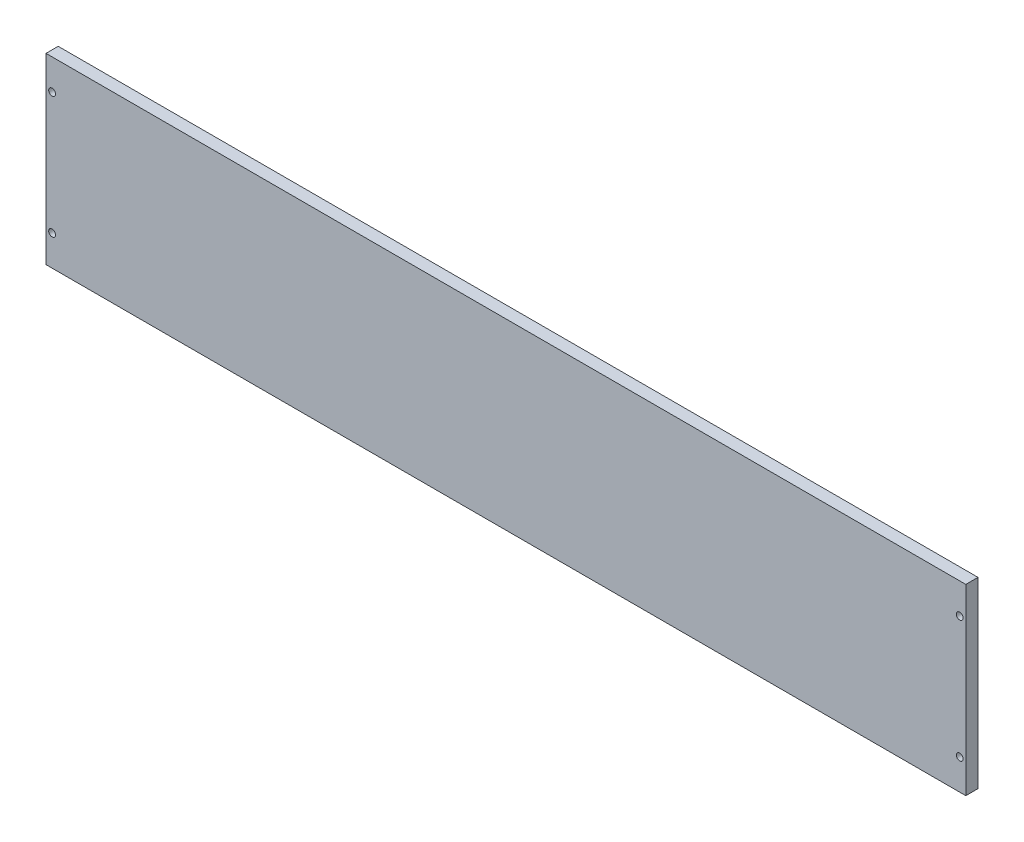
ISO-10303-21;
HEADER;
FILE_DESCRIPTION(('STEP AP214'),'2;1');
FILE_NAME('part.step','',(''),(''),'','','');
FILE_SCHEMA(('AUTOMOTIVE_DESIGN { 1 0 10303 214 1 1 1 1 }'));
ENDSEC;
DATA;
#1=APPLICATION_CONTEXT('core data for automotive mechanical design processes');
#2=APPLICATION_PROTOCOL_DEFINITION('international standard','automotive_design',2000,#1);
#3=PRODUCT_CONTEXT('',#1,'mechanical');
#4=PRODUCT('Part','Part','',(#3));
#5=PRODUCT_RELATED_PRODUCT_CATEGORY('part','',(#4));
#6=PRODUCT_DEFINITION_FORMATION('','',#4);
#7=PRODUCT_DEFINITION_CONTEXT('part definition',#1,'design');
#8=PRODUCT_DEFINITION('design','',#6,#7);
#9=PRODUCT_DEFINITION_SHAPE('','',#8);
#10=(LENGTH_UNIT() NAMED_UNIT(*) SI_UNIT(.MILLI.,.METRE.));
#11=(NAMED_UNIT(*) PLANE_ANGLE_UNIT() SI_UNIT($,.RADIAN.));
#12=(NAMED_UNIT(*) SI_UNIT($,.STERADIAN.) SOLID_ANGLE_UNIT());
#13=UNCERTAINTY_MEASURE_WITH_UNIT(LENGTH_MEASURE(1.E-05),#10,'distance_accuracy_value','');
#14=(GEOMETRIC_REPRESENTATION_CONTEXT(3) GLOBAL_UNCERTAINTY_ASSIGNED_CONTEXT((#13)) GLOBAL_UNIT_ASSIGNED_CONTEXT((#10,
#11,#12)) REPRESENTATION_CONTEXT('',''));
#15=CARTESIAN_POINT('',(0.,0.,0.));
#16=DIRECTION('',(0.,0.,1.));
#17=DIRECTION('',(1.,0.,0.));
#18=AXIS2_PLACEMENT_3D('',#15,#16,#17);
#19=CARTESIAN_POINT('',(0.,0.,5.08));
#20=DIRECTION('',(1.,0.,0.));
#21=DIRECTION('',(0.,0.,-1.));
#22=AXIS2_PLACEMENT_3D('',#19,#20,#21);
#23=PLANE('',#22);
#24=DIRECTION('',(0.,-1.,0.));
#25=VECTOR('',#24,1.);
#26=CARTESIAN_POINT('',(0.,0.,0.));
#27=LINE('',#26,#25);
#28=CARTESIAN_POINT('',(0.,76.2,0.));
#29=VERTEX_POINT('',#28);
#30=CARTESIAN_POINT('',(0.,0.,0.));
#31=VERTEX_POINT('',#30);
#32=EDGE_CURVE('E105',#29,#31,#27,.T.);
#33=ORIENTED_EDGE('',*,*,#32,.T.);
#34=DIRECTION('',(0.,0.,-1.));
#35=VECTOR('',#34,1.);
#36=CARTESIAN_POINT('',(0.,0.,5.08));
#37=LINE('',#36,#35);
#38=CARTESIAN_POINT('',(0.,0.,5.08));
#39=VERTEX_POINT('',#38);
#40=EDGE_CURVE('E11',#39,#31,#37,.T.);
#41=ORIENTED_EDGE('',*,*,#40,.F.);
#42=DIRECTION('',(0.,-1.,0.));
#43=VECTOR('',#42,1.);
#44=CARTESIAN_POINT('',(0.,0.,5.08));
#45=LINE('',#44,#43);
#46=CARTESIAN_POINT('',(0.,76.2,5.08));
#47=VERTEX_POINT('',#46);
#48=EDGE_CURVE('E93',#47,#39,#45,.T.);
#49=ORIENTED_EDGE('',*,*,#48,.F.);
#50=DIRECTION('',(0.,0.,-1.));
#51=VECTOR('',#50,1.);
#52=CARTESIAN_POINT('',(0.,76.2,5.08));
#53=LINE('',#52,#51);
#54=EDGE_CURVE('E101',#47,#29,#53,.T.);
#55=ORIENTED_EDGE('',*,*,#54,.T.);
#56=EDGE_LOOP('',(#33,#41,#49,#55));
#57=FACE_BOUND('',#56,.T.);
#58=ADVANCED_FACE('F42',(#57),#23,.F.);
#59=CARTESIAN_POINT('',(0.,0.,5.08));
#60=DIRECTION('',(0.,1.,0.));
#61=DIRECTION('',(0.,0.,1.));
#62=AXIS2_PLACEMENT_3D('',#59,#60,#61);
#63=PLANE('',#62);
#64=DIRECTION('',(1.,0.,0.));
#65=VECTOR('',#64,1.);
#66=CARTESIAN_POINT('',(0.,0.,0.));
#67=LINE('',#66,#65);
#68=CARTESIAN_POINT('',(383.0066,0.,0.));
#69=VERTEX_POINT('',#68);
#70=EDGE_CURVE('E97',#31,#69,#67,.T.);
#71=ORIENTED_EDGE('',*,*,#70,.T.);
#72=DIRECTION('',(0.,0.,-1.));
#73=VECTOR('',#72,1.);
#74=CARTESIAN_POINT('',(383.0066,0.,5.08));
#75=LINE('',#74,#73);
#76=CARTESIAN_POINT('',(383.0066,0.,5.08));
#77=VERTEX_POINT('',#76);
#78=EDGE_CURVE('E50',#77,#69,#75,.T.);
#79=ORIENTED_EDGE('',*,*,#78,.F.);
#80=DIRECTION('',(1.,0.,0.));
#81=VECTOR('',#80,1.);
#82=CARTESIAN_POINT('',(0.,0.,5.08));
#83=LINE('',#82,#81);
#84=EDGE_CURVE('E88',#39,#77,#83,.T.);
#85=ORIENTED_EDGE('',*,*,#84,.F.);
#86=ORIENTED_EDGE('',*,*,#40,.T.);
#87=EDGE_LOOP('',(#71,#79,#85,#86));
#88=FACE_BOUND('',#87,.T.);
#89=ADVANCED_FACE('F96',(#88),#63,.F.);
#90=CARTESIAN_POINT('',(383.0066,0.,5.08));
#91=DIRECTION('',(-1.,0.,0.));
#92=DIRECTION('',(0.,0.,1.));
#93=AXIS2_PLACEMENT_3D('',#90,#91,#92);
#94=PLANE('',#93);
#95=DIRECTION('',(0.,1.,0.));
#96=VECTOR('',#95,1.);
#97=CARTESIAN_POINT('',(383.0066,0.,0.));
#98=LINE('',#97,#96);
#99=CARTESIAN_POINT('',(383.0066,76.2,0.));
#100=VERTEX_POINT('',#99);
#101=EDGE_CURVE('E75',#69,#100,#98,.T.);
#102=ORIENTED_EDGE('',*,*,#101,.T.);
#103=DIRECTION('',(0.,0.,-1.));
#104=VECTOR('',#103,1.);
#105=CARTESIAN_POINT('',(383.0066,76.2,5.08));
#106=LINE('',#105,#104);
#107=CARTESIAN_POINT('',(383.0066,76.2,5.08));
#108=VERTEX_POINT('',#107);
#109=EDGE_CURVE('E98',#108,#100,#106,.T.);
#110=ORIENTED_EDGE('',*,*,#109,.F.);
#111=DIRECTION('',(0.,1.,0.));
#112=VECTOR('',#111,1.);
#113=CARTESIAN_POINT('',(383.0066,0.,5.08));
#114=LINE('',#113,#112);
#115=EDGE_CURVE('E91',#77,#108,#114,.T.);
#116=ORIENTED_EDGE('',*,*,#115,.F.);
#117=ORIENTED_EDGE('',*,*,#78,.T.);
#118=EDGE_LOOP('',(#102,#110,#116,#117));
#119=FACE_BOUND('',#118,.T.);
#120=ADVANCED_FACE('F99',(#119),#94,.F.);
#121=CARTESIAN_POINT('',(0.,76.2,5.08));
#122=DIRECTION('',(0.,-1.,0.));
#123=DIRECTION('',(0.,0.,-1.));
#124=AXIS2_PLACEMENT_3D('',#121,#122,#123);
#125=PLANE('',#124);
#126=DIRECTION('',(-1.,0.,0.));
#127=VECTOR('',#126,1.);
#128=CARTESIAN_POINT('',(0.,76.2,0.));
#129=LINE('',#128,#127);
#130=EDGE_CURVE('E81',#100,#29,#129,.T.);
#131=ORIENTED_EDGE('',*,*,#130,.T.);
#132=ORIENTED_EDGE('',*,*,#54,.F.);
#133=DIRECTION('',(-1.,0.,0.));
#134=VECTOR('',#133,1.);
#135=CARTESIAN_POINT('',(0.,76.2,5.08));
#136=LINE('',#135,#134);
#137=EDGE_CURVE('E58',#108,#47,#136,.T.);
#138=ORIENTED_EDGE('',*,*,#137,.F.);
#139=ORIENTED_EDGE('',*,*,#109,.T.);
#140=EDGE_LOOP('',(#131,#132,#138,#139));
#141=FACE_BOUND('',#140,.T.);
#142=ADVANCED_FACE('F113',(#141),#125,.F.);
#143=CARTESIAN_POINT('',(0.,0.,5.08));
#144=DIRECTION('',(0.,0.,-1.));
#145=DIRECTION('',(-1.,0.,0.));
#146=AXIS2_PLACEMENT_3D('',#143,#144,#145);
#147=PLANE('',#146);
#148=CARTESIAN_POINT('',(2.54000000000001,12.7,5.08));
#149=DIRECTION('',(0.,0.,1.));
#150=DIRECTION('',(1.,0.,0.));
#151=AXIS2_PLACEMENT_3D('',#148,#149,#150);
#152=CIRCLE('',#151,1.4224);
#153=CARTESIAN_POINT('',(3.96240000000001,12.7,5.08));
#154=VERTEX_POINT('',#153);
#155=EDGE_CURVE('E122',#154,#154,#152,.T.);
#156=ORIENTED_EDGE('',*,*,#155,.F.);
#157=EDGE_LOOP('',(#156));
#158=FACE_BOUND('',#157,.T.);
#159=CARTESIAN_POINT('',(380.4666,63.5,5.08));
#160=DIRECTION('',(0.,0.,1.));
#161=DIRECTION('',(1.,0.,0.));
#162=AXIS2_PLACEMENT_3D('',#159,#160,#161);
#163=CIRCLE('',#162,1.4224);
#164=CARTESIAN_POINT('',(381.889,63.5,5.08));
#165=VERTEX_POINT('',#164);
#166=EDGE_CURVE('E128',#165,#165,#163,.T.);
#167=ORIENTED_EDGE('',*,*,#166,.F.);
#168=EDGE_LOOP('',(#167));
#169=FACE_BOUND('',#168,.T.);
#170=CARTESIAN_POINT('',(380.4666,12.7,5.08));
#171=DIRECTION('',(0.,0.,1.));
#172=DIRECTION('',(1.,0.,0.));
#173=AXIS2_PLACEMENT_3D('',#170,#171,#172);
#174=CIRCLE('',#173,1.42239999999999);
#175=CARTESIAN_POINT('',(381.889,12.7,5.08));
#176=VERTEX_POINT('',#175);
#177=EDGE_CURVE('E129',#176,#176,#174,.T.);
#178=ORIENTED_EDGE('',*,*,#177,.F.);
#179=EDGE_LOOP('',(#178));
#180=FACE_BOUND('',#179,.T.);
#181=CARTESIAN_POINT('',(2.54,63.5,5.08));
#182=DIRECTION('',(0.,0.,1.));
#183=DIRECTION('',(1.,0.,0.));
#184=AXIS2_PLACEMENT_3D('',#181,#182,#183);
#185=CIRCLE('',#184,1.4224);
#186=CARTESIAN_POINT('',(3.9624,63.5,5.08));
#187=VERTEX_POINT('',#186);
#188=EDGE_CURVE('E119',#187,#187,#185,.T.);
#189=ORIENTED_EDGE('',*,*,#188,.F.);
#190=EDGE_LOOP('',(#189));
#191=FACE_BOUND('',#190,.T.);
#192=ORIENTED_EDGE('',*,*,#48,.T.);
#193=ORIENTED_EDGE('',*,*,#84,.T.);
#194=ORIENTED_EDGE('',*,*,#115,.T.);
#195=ORIENTED_EDGE('',*,*,#137,.T.);
#196=EDGE_LOOP('',(#192,#193,#194,#195));
#197=FACE_BOUND('',#196,.T.);
#198=ADVANCED_FACE('F89',(#158,#169,#180,#191,#197),#147,.F.);
#199=CARTESIAN_POINT('',(0.,0.,0.));
#200=DIRECTION('',(0.,0.,-1.));
#201=DIRECTION('',(-1.,0.,0.));
#202=AXIS2_PLACEMENT_3D('',#199,#200,#201);
#203=PLANE('',#202);
#204=CARTESIAN_POINT('',(2.54000000000001,12.7,0.));
#205=DIRECTION('',(0.,0.,1.));
#206=DIRECTION('',(1.,0.,0.));
#207=AXIS2_PLACEMENT_3D('',#204,#205,#206);
#208=CIRCLE('',#207,1.4224);
#209=CARTESIAN_POINT('',(3.96240000000001,12.7,0.));
#210=VERTEX_POINT('',#209);
#211=EDGE_CURVE('E132',#210,#210,#208,.T.);
#212=ORIENTED_EDGE('',*,*,#211,.T.);
#213=EDGE_LOOP('',(#212));
#214=FACE_BOUND('',#213,.T.);
#215=CARTESIAN_POINT('',(380.4666,63.5,0.));
#216=DIRECTION('',(0.,0.,1.));
#217=DIRECTION('',(1.,0.,0.));
#218=AXIS2_PLACEMENT_3D('',#215,#216,#217);
#219=CIRCLE('',#218,1.4224);
#220=CARTESIAN_POINT('',(381.889,63.5,0.));
#221=VERTEX_POINT('',#220);
#222=EDGE_CURVE('E125',#221,#221,#219,.T.);
#223=ORIENTED_EDGE('',*,*,#222,.T.);
#224=EDGE_LOOP('',(#223));
#225=FACE_BOUND('',#224,.T.);
#226=CARTESIAN_POINT('',(380.4666,12.7,0.));
#227=DIRECTION('',(0.,0.,1.));
#228=DIRECTION('',(1.,0.,0.));
#229=AXIS2_PLACEMENT_3D('',#226,#227,#228);
#230=CIRCLE('',#229,1.42239999999999);
#231=CARTESIAN_POINT('',(381.889,12.7,0.));
#232=VERTEX_POINT('',#231);
#233=EDGE_CURVE('E137',#232,#232,#230,.T.);
#234=ORIENTED_EDGE('',*,*,#233,.T.);
#235=EDGE_LOOP('',(#234));
#236=FACE_BOUND('',#235,.T.);
#237=CARTESIAN_POINT('',(2.54,63.5,0.));
#238=DIRECTION('',(0.,0.,1.));
#239=DIRECTION('',(1.,0.,0.));
#240=AXIS2_PLACEMENT_3D('',#237,#238,#239);
#241=CIRCLE('',#240,1.4224);
#242=CARTESIAN_POINT('',(3.9624,63.5,0.));
#243=VERTEX_POINT('',#242);
#244=EDGE_CURVE('E108',#243,#243,#241,.T.);
#245=ORIENTED_EDGE('',*,*,#244,.T.);
#246=EDGE_LOOP('',(#245));
#247=FACE_BOUND('',#246,.T.);
#248=ORIENTED_EDGE('',*,*,#32,.F.);
#249=ORIENTED_EDGE('',*,*,#130,.F.);
#250=ORIENTED_EDGE('',*,*,#101,.F.);
#251=ORIENTED_EDGE('',*,*,#70,.F.);
#252=EDGE_LOOP('',(#248,#249,#250,#251));
#253=FACE_BOUND('',#252,.T.);
#254=ADVANCED_FACE('F116',(#214,#225,#236,#247,#253),#203,.T.);
#255=CARTESIAN_POINT('',(2.54,63.5,0.));
#256=DIRECTION('',(0.,0.,1.));
#257=DIRECTION('',(1.,0.,0.));
#258=AXIS2_PLACEMENT_3D('',#255,#256,#257);
#259=CYLINDRICAL_SURFACE('',#258,1.4224);
#260=ORIENTED_EDGE('',*,*,#244,.F.);
#261=EDGE_LOOP('',(#260));
#262=FACE_BOUND('',#261,.T.);
#263=ORIENTED_EDGE('',*,*,#188,.T.);
#264=EDGE_LOOP('',(#263));
#265=FACE_BOUND('',#264,.T.);
#266=ADVANCED_FACE('F151',(#262,#265),#259,.F.);
#267=CARTESIAN_POINT('',(380.4666,12.7,0.));
#268=DIRECTION('',(0.,0.,1.));
#269=DIRECTION('',(1.,0.,0.));
#270=AXIS2_PLACEMENT_3D('',#267,#268,#269);
#271=CYLINDRICAL_SURFACE('',#270,1.42239999999999);
#272=ORIENTED_EDGE('',*,*,#233,.F.);
#273=EDGE_LOOP('',(#272));
#274=FACE_BOUND('',#273,.T.);
#275=ORIENTED_EDGE('',*,*,#177,.T.);
#276=EDGE_LOOP('',(#275));
#277=FACE_BOUND('',#276,.T.);
#278=ADVANCED_FACE('F143',(#274,#277),#271,.F.);
#279=CARTESIAN_POINT('',(380.4666,63.5,0.));
#280=DIRECTION('',(0.,0.,1.));
#281=DIRECTION('',(1.,0.,0.));
#282=AXIS2_PLACEMENT_3D('',#279,#280,#281);
#283=CYLINDRICAL_SURFACE('',#282,1.4224);
#284=ORIENTED_EDGE('',*,*,#222,.F.);
#285=EDGE_LOOP('',(#284));
#286=FACE_BOUND('',#285,.T.);
#287=ORIENTED_EDGE('',*,*,#166,.T.);
#288=EDGE_LOOP('',(#287));
#289=FACE_BOUND('',#288,.T.);
#290=ADVANCED_FACE('F159',(#286,#289),#283,.F.);
#291=CARTESIAN_POINT('',(2.54000000000001,12.7,0.));
#292=DIRECTION('',(0.,0.,1.));
#293=DIRECTION('',(1.,0.,0.));
#294=AXIS2_PLACEMENT_3D('',#291,#292,#293);
#295=CYLINDRICAL_SURFACE('',#294,1.4224);
#296=ORIENTED_EDGE('',*,*,#211,.F.);
#297=EDGE_LOOP('',(#296));
#298=FACE_BOUND('',#297,.T.);
#299=ORIENTED_EDGE('',*,*,#155,.T.);
#300=EDGE_LOOP('',(#299));
#301=FACE_BOUND('',#300,.T.);
#302=ADVANCED_FACE('F210',(#298,#301),#295,.F.);
#303=CLOSED_SHELL('',(#58,#89,#120,#142,#198,#254,#266,#278,#290,#302));
#304=MANIFOLD_SOLID_BREP('B2',#303);
#305=ADVANCED_BREP_SHAPE_REPRESENTATION('',(#18,#304),#14);
#306=SHAPE_DEFINITION_REPRESENTATION(#9,#305);
ENDSEC;
END-ISO-10303-21;
